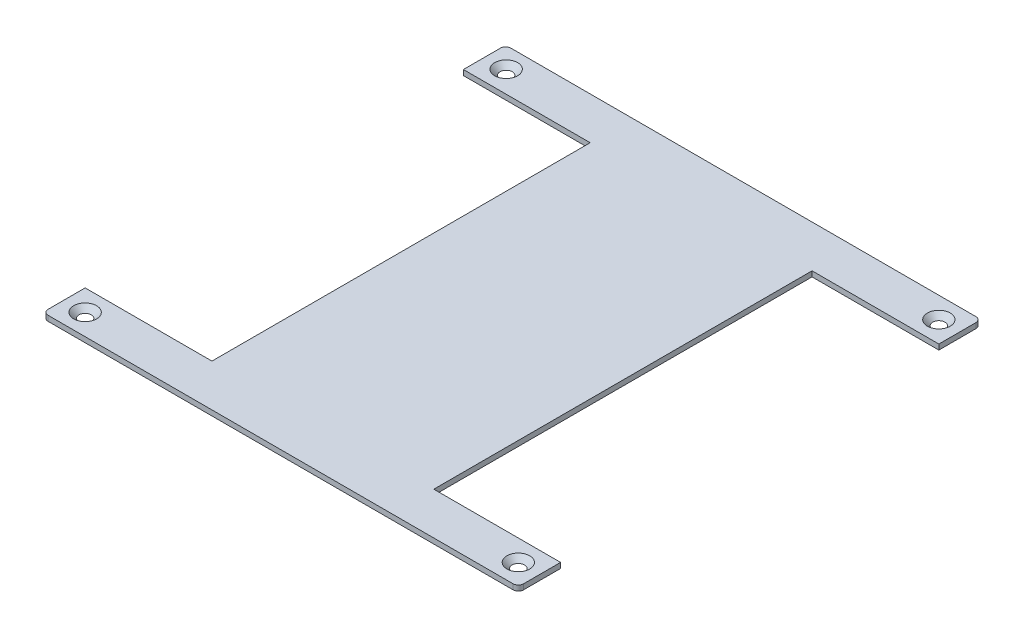
ISO-10303-21;
HEADER;
FILE_DESCRIPTION(('STEP AP214'),'2;1');
FILE_NAME('part.step','',(''),(''),'','','');
FILE_SCHEMA(('AUTOMOTIVE_DESIGN { 1 0 10303 214 1 1 1 1 }'));
ENDSEC;
DATA;
#1=APPLICATION_CONTEXT('core data for automotive mechanical design processes');
#2=APPLICATION_PROTOCOL_DEFINITION('international standard','automotive_design',2000,#1);
#3=PRODUCT_CONTEXT('',#1,'mechanical');
#4=PRODUCT('Part','Part','',(#3));
#5=PRODUCT_RELATED_PRODUCT_CATEGORY('part','',(#4));
#6=PRODUCT_DEFINITION_FORMATION('','',#4);
#7=PRODUCT_DEFINITION_CONTEXT('part definition',#1,'design');
#8=PRODUCT_DEFINITION('design','',#6,#7);
#9=PRODUCT_DEFINITION_SHAPE('','',#8);
#10=(LENGTH_UNIT() NAMED_UNIT(*) SI_UNIT(.MILLI.,.METRE.));
#11=(NAMED_UNIT(*) PLANE_ANGLE_UNIT() SI_UNIT($,.RADIAN.));
#12=(NAMED_UNIT(*) SI_UNIT($,.STERADIAN.) SOLID_ANGLE_UNIT());
#13=UNCERTAINTY_MEASURE_WITH_UNIT(LENGTH_MEASURE(1.E-05),#10,'distance_accuracy_value','');
#14=(GEOMETRIC_REPRESENTATION_CONTEXT(3) GLOBAL_UNCERTAINTY_ASSIGNED_CONTEXT((#13)) GLOBAL_UNIT_ASSIGNED_CONTEXT((#10,
#11,#12)) REPRESENTATION_CONTEXT('',''));
#15=CARTESIAN_POINT('',(0.,0.,0.));
#16=DIRECTION('',(0.,0.,1.));
#17=DIRECTION('',(1.,0.,0.));
#18=AXIS2_PLACEMENT_3D('',#15,#16,#17);
#19=CARTESIAN_POINT('',(-70.2264196721312,1.27,-30.9546885245902));
#20=DIRECTION('',(1.,0.,0.));
#21=DIRECTION('',(0.,0.,-1.));
#22=AXIS2_PLACEMENT_3D('',#19,#20,#21);
#23=PLANE('',#22);
#24=DIRECTION('',(0.,0.,1.));
#25=VECTOR('',#24,1.);
#26=CARTESIAN_POINT('',(-70.2264196721312,1.27,-30.9546885245902));
#27=LINE('',#26,#25);
#28=CARTESIAN_POINT('',(-70.2264196721312,1.27,70.1373114754098));
#29=VERTEX_POINT('',#28);
#30=CARTESIAN_POINT('',(-70.2264196721312,1.27,79.0273114754098));
#31=VERTEX_POINT('',#30);
#32=EDGE_CURVE('E199',#29,#31,#27,.T.);
#33=ORIENTED_EDGE('',*,*,#32,.F.);
#34=DIRECTION('',(0.,1.,0.));
#35=VECTOR('',#34,1.);
#36=CARTESIAN_POINT('',(-70.2264196721312,-3.81,70.1373114754098));
#37=LINE('',#36,#35);
#38=CARTESIAN_POINT('',(-70.2264196721312,0.,70.1373114754098));
#39=VERTEX_POINT('',#38);
#40=EDGE_CURVE('E272',#39,#29,#37,.T.);
#41=ORIENTED_EDGE('',*,*,#40,.F.);
#42=DIRECTION('',(0.,0.,1.));
#43=VECTOR('',#42,1.);
#44=CARTESIAN_POINT('',(-70.2264196721312,0.,-30.9546885245902));
#45=LINE('',#44,#43);
#46=CARTESIAN_POINT('',(-70.2264196721312,0.,79.0273114754098));
#47=VERTEX_POINT('',#46);
#48=EDGE_CURVE('E189',#39,#47,#45,.T.);
#49=ORIENTED_EDGE('',*,*,#48,.T.);
#50=DIRECTION('',(0.,-1.,0.));
#51=VECTOR('',#50,1.);
#52=CARTESIAN_POINT('',(-70.2264196721312,1.27,79.0273114754098));
#53=LINE('',#52,#51);
#54=EDGE_CURVE('E217',#47,#31,#53,.F.);
#55=ORIENTED_EDGE('',*,*,#54,.T.);
#56=EDGE_LOOP('',(#33,#41,#49,#55));
#57=FACE_BOUND('',#56,.T.);
#58=ADVANCED_FACE('F35',(#57),#23,.F.);
#59=CARTESIAN_POINT('',(44.0735803278688,1.27,-30.9546885245902));
#60=DIRECTION('',(-1.,0.,0.));
#61=DIRECTION('',(0.,0.,1.));
#62=AXIS2_PLACEMENT_3D('',#59,#60,#61);
#63=PLANE('',#62);
#64=DIRECTION('',(0.,0.,-1.));
#65=VECTOR('',#64,1.);
#66=CARTESIAN_POINT('',(44.0735803278688,0.,-30.9546885245902));
#67=LINE('',#66,#65);
#68=CARTESIAN_POINT('',(44.0735803278688,0.,79.0273114754098));
#69=VERTEX_POINT('',#68);
#70=CARTESIAN_POINT('',(44.0735803278688,0.,70.1373114754098));
#71=VERTEX_POINT('',#70);
#72=EDGE_CURVE('E193',#69,#71,#67,.T.);
#73=ORIENTED_EDGE('',*,*,#72,.T.);
#74=DIRECTION('',(0.,1.,0.));
#75=VECTOR('',#74,1.);
#76=CARTESIAN_POINT('',(44.0735803278688,-3.81,70.1373114754098));
#77=LINE('',#76,#75);
#78=CARTESIAN_POINT('',(44.0735803278688,1.27,70.1373114754098));
#79=VERTEX_POINT('',#78);
#80=EDGE_CURVE('E254',#71,#79,#77,.T.);
#81=ORIENTED_EDGE('',*,*,#80,.T.);
#82=DIRECTION('',(0.,0.,-1.));
#83=VECTOR('',#82,1.);
#84=CARTESIAN_POINT('',(44.0735803278688,1.27,-30.9546885245902));
#85=LINE('',#84,#83);
#86=CARTESIAN_POINT('',(44.0735803278688,1.27,79.0273114754098));
#87=VERTEX_POINT('',#86);
#88=EDGE_CURVE('E172',#87,#79,#85,.T.);
#89=ORIENTED_EDGE('',*,*,#88,.F.);
#90=DIRECTION('',(0.,-1.,0.));
#91=VECTOR('',#90,1.);
#92=CARTESIAN_POINT('',(44.0735803278688,1.27,79.0273114754098));
#93=LINE('',#92,#91);
#94=EDGE_CURVE('E229',#87,#69,#93,.T.);
#95=ORIENTED_EDGE('',*,*,#94,.T.);
#96=EDGE_LOOP('',(#73,#81,#89,#95));
#97=FACE_BOUND('',#96,.T.);
#98=ADVANCED_FACE('F323',(#97),#63,.F.);
#99=CARTESIAN_POINT('',(-70.2264196721312,0.,-29.6846885245902));
#100=VERTEX_POINT('',#99);
#101=CARTESIAN_POINT('',(-70.2264196721312,0.,-20.7946885245901));
#102=VERTEX_POINT('',#101);
#103=EDGE_CURVE('E185',#100,#102,#45,.T.);
#104=ORIENTED_EDGE('',*,*,#103,.T.);
#105=DIRECTION('',(0.,1.,0.));
#106=VECTOR('',#105,1.);
#107=CARTESIAN_POINT('',(-70.2264196721312,-3.81,-20.7946885245901));
#108=LINE('',#107,#106);
#109=CARTESIAN_POINT('',(-70.2264196721312,1.27,-20.7946885245901));
#110=VERTEX_POINT('',#109);
#111=EDGE_CURVE('E58',#102,#110,#108,.T.);
#112=ORIENTED_EDGE('',*,*,#111,.T.);
#113=CARTESIAN_POINT('',(-70.2264196721312,1.27,-29.6846885245902));
#114=VERTEX_POINT('',#113);
#115=EDGE_CURVE('E178',#114,#110,#27,.T.);
#116=ORIENTED_EDGE('',*,*,#115,.F.);
#117=DIRECTION('',(0.,-1.,0.));
#118=VECTOR('',#117,1.);
#119=CARTESIAN_POINT('',(-70.2264196721312,1.27,-29.6846885245902));
#120=LINE('',#119,#118);
#121=EDGE_CURVE('E214',#114,#100,#120,.T.);
#122=ORIENTED_EDGE('',*,*,#121,.T.);
#123=EDGE_LOOP('',(#104,#112,#116,#122));
#124=FACE_BOUND('',#123,.T.);
#125=ADVANCED_FACE('F338',(#124),#23,.F.);
#126=CARTESIAN_POINT('',(-70.2264196721312,1.27,80.2973114754098));
#127=DIRECTION('',(0.,0.,-1.));
#128=DIRECTION('',(-1.,0.,0.));
#129=AXIS2_PLACEMENT_3D('',#126,#127,#128);
#130=PLANE('',#129);
#131=DIRECTION('',(1.,0.,0.));
#132=VECTOR('',#131,1.);
#133=CARTESIAN_POINT('',(-70.2264196721312,1.27,80.2973114754098));
#134=LINE('',#133,#132);
#135=CARTESIAN_POINT('',(-68.9564196721312,1.27,80.2973114754098));
#136=VERTEX_POINT('',#135);
#137=CARTESIAN_POINT('',(42.8035803278688,1.27,80.2973114754098));
#138=VERTEX_POINT('',#137);
#139=EDGE_CURVE('E173',#136,#138,#134,.T.);
#140=ORIENTED_EDGE('',*,*,#139,.F.);
#141=DIRECTION('',(0.,-1.,0.));
#142=VECTOR('',#141,1.);
#143=CARTESIAN_POINT('',(-68.9564196721312,1.27,80.2973114754098));
#144=LINE('',#143,#142);
#145=CARTESIAN_POINT('',(-68.9564196721312,0.,80.2973114754098));
#146=VERTEX_POINT('',#145);
#147=EDGE_CURVE('E201',#136,#146,#144,.T.);
#148=ORIENTED_EDGE('',*,*,#147,.T.);
#149=DIRECTION('',(1.,0.,0.));
#150=VECTOR('',#149,1.);
#151=CARTESIAN_POINT('',(-70.2264196721312,0.,80.2973114754098));
#152=LINE('',#151,#150);
#153=CARTESIAN_POINT('',(42.8035803278688,0.,80.2973114754098));
#154=VERTEX_POINT('',#153);
#155=EDGE_CURVE('E188',#146,#154,#152,.T.);
#156=ORIENTED_EDGE('',*,*,#155,.T.);
#157=DIRECTION('',(0.,-1.,0.));
#158=VECTOR('',#157,1.);
#159=CARTESIAN_POINT('',(42.8035803278688,1.27,80.2973114754098));
#160=LINE('',#159,#158);
#161=EDGE_CURVE('E184',#154,#138,#160,.F.);
#162=ORIENTED_EDGE('',*,*,#161,.T.);
#163=EDGE_LOOP('',(#140,#148,#156,#162));
#164=FACE_BOUND('',#163,.T.);
#165=ADVANCED_FACE('F315',(#164),#130,.F.);
#166=CARTESIAN_POINT('',(44.0735803278688,1.27,-20.7946885245902));
#167=VERTEX_POINT('',#166);
#168=CARTESIAN_POINT('',(44.0735803278688,1.27,-29.6846885245902));
#169=VERTEX_POINT('',#168);
#170=EDGE_CURVE('E162',#167,#169,#85,.T.);
#171=ORIENTED_EDGE('',*,*,#170,.F.);
#172=DIRECTION('',(0.,1.,0.));
#173=VECTOR('',#172,1.);
#174=CARTESIAN_POINT('',(44.0735803278688,-3.81,-20.7946885245902));
#175=LINE('',#174,#173);
#176=CARTESIAN_POINT('',(44.0735803278688,0.,-20.7946885245902));
#177=VERTEX_POINT('',#176);
#178=EDGE_CURVE('E146',#177,#167,#175,.T.);
#179=ORIENTED_EDGE('',*,*,#178,.F.);
#180=CARTESIAN_POINT('',(44.0735803278688,0.,-29.6846885245902));
#181=VERTEX_POINT('',#180);
#182=EDGE_CURVE('E192',#177,#181,#67,.T.);
#183=ORIENTED_EDGE('',*,*,#182,.T.);
#184=DIRECTION('',(0.,-1.,0.));
#185=VECTOR('',#184,1.);
#186=CARTESIAN_POINT('',(44.0735803278688,1.27,-29.6846885245902));
#187=LINE('',#186,#185);
#188=EDGE_CURVE('E170',#181,#169,#187,.F.);
#189=ORIENTED_EDGE('',*,*,#188,.T.);
#190=EDGE_LOOP('',(#171,#179,#183,#189));
#191=FACE_BOUND('',#190,.T.);
#192=ADVANCED_FACE('F168',(#191),#63,.F.);
#193=CARTESIAN_POINT('',(-70.2264196721312,1.27,-30.9546885245902));
#194=DIRECTION('',(0.,0.,1.));
#195=DIRECTION('',(1.,0.,0.));
#196=AXIS2_PLACEMENT_3D('',#193,#194,#195);
#197=PLANE('',#196);
#198=DIRECTION('',(-1.,0.,0.));
#199=VECTOR('',#198,1.);
#200=CARTESIAN_POINT('',(-70.2264196721312,1.27,-30.9546885245902));
#201=LINE('',#200,#199);
#202=CARTESIAN_POINT('',(42.8035803278688,1.27,-30.9546885245902));
#203=VERTEX_POINT('',#202);
#204=CARTESIAN_POINT('',(-68.9564196721312,1.27,-30.9546885245902));
#205=VERTEX_POINT('',#204);
#206=EDGE_CURVE('E176',#203,#205,#201,.T.);
#207=ORIENTED_EDGE('',*,*,#206,.F.);
#208=DIRECTION('',(0.,-1.,0.));
#209=VECTOR('',#208,1.);
#210=CARTESIAN_POINT('',(42.8035803278688,1.27,-30.9546885245902));
#211=LINE('',#210,#209);
#212=CARTESIAN_POINT('',(42.8035803278688,0.,-30.9546885245902));
#213=VERTEX_POINT('',#212);
#214=EDGE_CURVE('E234',#203,#213,#211,.T.);
#215=ORIENTED_EDGE('',*,*,#214,.T.);
#216=DIRECTION('',(-1.,0.,0.));
#217=VECTOR('',#216,1.);
#218=CARTESIAN_POINT('',(-70.2264196721312,0.,-30.9546885245902));
#219=LINE('',#218,#217);
#220=CARTESIAN_POINT('',(-68.9564196721312,0.,-30.9546885245902));
#221=VERTEX_POINT('',#220);
#222=EDGE_CURVE('E196',#213,#221,#219,.T.);
#223=ORIENTED_EDGE('',*,*,#222,.T.);
#224=DIRECTION('',(0.,-1.,0.));
#225=VECTOR('',#224,1.);
#226=CARTESIAN_POINT('',(-68.9564196721312,1.27,-30.9546885245902));
#227=LINE('',#226,#225);
#228=EDGE_CURVE('E232',#221,#205,#227,.F.);
#229=ORIENTED_EDGE('',*,*,#228,.T.);
#230=EDGE_LOOP('',(#207,#215,#223,#229));
#231=FACE_BOUND('',#230,.T.);
#232=ADVANCED_FACE('F384',(#231),#197,.F.);
#233=CARTESIAN_POINT('',(0.,1.27,0.));
#234=DIRECTION('',(0.,1.,0.));
#235=DIRECTION('',(0.,0.,1.));
#236=AXIS2_PLACEMENT_3D('',#233,#234,#235);
#237=PLANE('',#236);
#238=DIRECTION('',(1.,0.,0.));
#239=VECTOR('',#238,1.);
#240=CARTESIAN_POINT('',(13.5935803278689,1.27,70.1373114754098));
#241=LINE('',#240,#239);
#242=CARTESIAN_POINT('',(13.5935803278689,1.27,70.1373114754098));
#243=VERTEX_POINT('',#242);
#244=EDGE_CURVE('E156',#243,#79,#241,.T.);
#245=ORIENTED_EDGE('',*,*,#244,.F.);
#246=DIRECTION('',(0.,0.,1.));
#247=VECTOR('',#246,1.);
#248=CARTESIAN_POINT('',(13.5935803278688,1.27,-20.7946885245902));
#249=LINE('',#248,#247);
#250=CARTESIAN_POINT('',(13.5935803278688,1.27,-20.7946885245902));
#251=VERTEX_POINT('',#250);
#252=EDGE_CURVE('E165',#251,#243,#249,.T.);
#253=ORIENTED_EDGE('',*,*,#252,.F.);
#254=DIRECTION('',(-1.,0.,0.));
#255=VECTOR('',#254,1.);
#256=CARTESIAN_POINT('',(44.0735803278688,1.27,-20.7946885245902));
#257=LINE('',#256,#255);
#258=EDGE_CURVE('E149',#167,#251,#257,.T.);
#259=ORIENTED_EDGE('',*,*,#258,.F.);
#260=ORIENTED_EDGE('',*,*,#170,.T.);
#261=CARTESIAN_POINT('',(42.8035803278688,1.27,-29.6846885245902));
#262=DIRECTION('',(0.,1.,0.));
#263=DIRECTION('',(0.,0.,1.));
#264=AXIS2_PLACEMENT_3D('',#261,#262,#263);
#265=CIRCLE('',#264,1.27);
#266=EDGE_CURVE('E222',#169,#203,#265,.T.);
#267=ORIENTED_EDGE('',*,*,#266,.T.);
#268=ORIENTED_EDGE('',*,*,#206,.T.);
#269=CARTESIAN_POINT('',(-68.9564196721312,1.27,-29.6846885245902));
#270=DIRECTION('',(0.,1.,0.));
#271=DIRECTION('',(0.,0.,1.));
#272=AXIS2_PLACEMENT_3D('',#269,#270,#271);
#273=CIRCLE('',#272,1.27);
#274=EDGE_CURVE('E220',#205,#114,#273,.T.);
#275=ORIENTED_EDGE('',*,*,#274,.T.);
#276=ORIENTED_EDGE('',*,*,#115,.T.);
#277=DIRECTION('',(-1.,0.,0.));
#278=VECTOR('',#277,1.);
#279=CARTESIAN_POINT('',(-70.2264196721312,1.27,-20.7946885245901));
#280=LINE('',#279,#278);
#281=CARTESIAN_POINT('',(-39.7464196721312,1.27,-20.7946885245901));
#282=VERTEX_POINT('',#281);
#283=EDGE_CURVE('E265',#282,#110,#280,.T.);
#284=ORIENTED_EDGE('',*,*,#283,.F.);
#285=DIRECTION('',(0.,0.,-1.));
#286=VECTOR('',#285,1.);
#287=CARTESIAN_POINT('',(-39.7464196721312,1.27,-20.7946885245901));
#288=LINE('',#287,#286);
#289=CARTESIAN_POINT('',(-39.7464196721312,1.27,70.1373114754098));
#290=VERTEX_POINT('',#289);
#291=EDGE_CURVE('E262',#290,#282,#288,.T.);
#292=ORIENTED_EDGE('',*,*,#291,.F.);
#293=DIRECTION('',(1.,0.,0.));
#294=VECTOR('',#293,1.);
#295=CARTESIAN_POINT('',(-39.7464196721312,1.27,70.1373114754098));
#296=LINE('',#295,#294);
#297=EDGE_CURVE('E267',#29,#290,#296,.T.);
#298=ORIENTED_EDGE('',*,*,#297,.F.);
#299=ORIENTED_EDGE('',*,*,#32,.T.);
#300=CARTESIAN_POINT('',(-68.9564196721312,1.27,79.0273114754098));
#301=DIRECTION('',(0.,1.,0.));
#302=DIRECTION('',(0.,0.,1.));
#303=AXIS2_PLACEMENT_3D('',#300,#301,#302);
#304=CIRCLE('',#303,1.27);
#305=EDGE_CURVE('E226',#31,#136,#304,.T.);
#306=ORIENTED_EDGE('',*,*,#305,.T.);
#307=ORIENTED_EDGE('',*,*,#139,.T.);
#308=CARTESIAN_POINT('',(42.8035803278688,1.27,79.0273114754098));
#309=DIRECTION('',(0.,1.,0.));
#310=DIRECTION('',(0.,0.,1.));
#311=AXIS2_PLACEMENT_3D('',#308,#309,#310);
#312=CIRCLE('',#311,1.27);
#313=EDGE_CURVE('E224',#138,#87,#312,.T.);
#314=ORIENTED_EDGE('',*,*,#313,.T.);
#315=ORIENTED_EDGE('',*,*,#88,.T.);
#316=EDGE_LOOP('',(#245,#253,#259,#260,#267,#268,#275,#276,#284,#292,#298,#299,#306,#307,#314,#315));
#317=FACE_BOUND('',#316,.T.);
#318=CARTESIAN_POINT('',(-65.1464196721312,1.27,-26.0016885245902));
#319=DIRECTION('',(0.,1.,0.));
#320=DIRECTION('',(0.,0.,1.));
#321=AXIS2_PLACEMENT_3D('',#318,#319,#320);
#322=CIRCLE('',#321,2.75);
#323=CARTESIAN_POINT('',(-65.1464196721312,1.27,-23.2516885245902));
#324=VERTEX_POINT('',#323);
#325=EDGE_CURVE('E257',#324,#324,#322,.T.);
#326=ORIENTED_EDGE('',*,*,#325,.F.);
#327=EDGE_LOOP('',(#326));
#328=FACE_BOUND('',#327,.T.);
#329=CARTESIAN_POINT('',(38.9935803278688,1.27,-25.8746885245902));
#330=DIRECTION('',(0.,1.,0.));
#331=DIRECTION('',(0.,0.,1.));
#332=AXIS2_PLACEMENT_3D('',#329,#330,#331);
#333=CIRCLE('',#332,2.75);
#334=CARTESIAN_POINT('',(38.9935803278688,1.27,-23.1246885245902));
#335=VERTEX_POINT('',#334);
#336=EDGE_CURVE('E281',#335,#335,#333,.T.);
#337=ORIENTED_EDGE('',*,*,#336,.F.);
#338=EDGE_LOOP('',(#337));
#339=FACE_BOUND('',#338,.T.);
#340=CARTESIAN_POINT('',(38.9935803278688,1.27,75.2173114754098));
#341=DIRECTION('',(0.,1.,0.));
#342=DIRECTION('',(0.,0.,1.));
#343=AXIS2_PLACEMENT_3D('',#340,#341,#342);
#344=CIRCLE('',#343,2.75);
#345=CARTESIAN_POINT('',(38.9935803278688,1.27,77.9673114754098));
#346=VERTEX_POINT('',#345);
#347=EDGE_CURVE('E287',#346,#346,#344,.T.);
#348=ORIENTED_EDGE('',*,*,#347,.F.);
#349=EDGE_LOOP('',(#348));
#350=FACE_BOUND('',#349,.T.);
#351=CARTESIAN_POINT('',(-65.1464196721312,1.27,75.2173114754098));
#352=DIRECTION('',(0.,1.,0.));
#353=DIRECTION('',(0.,0.,1.));
#354=AXIS2_PLACEMENT_3D('',#351,#352,#353);
#355=CIRCLE('',#354,2.75);
#356=CARTESIAN_POINT('',(-65.1464196721312,1.27,77.9673114754098));
#357=VERTEX_POINT('',#356);
#358=EDGE_CURVE('E293',#357,#357,#355,.T.);
#359=ORIENTED_EDGE('',*,*,#358,.F.);
#360=EDGE_LOOP('',(#359));
#361=FACE_BOUND('',#360,.T.);
#362=ADVANCED_FACE('F160',(#317,#328,#339,#350,#361),#237,.T.);
#363=CARTESIAN_POINT('',(0.,0.,0.));
#364=DIRECTION('',(0.,1.,0.));
#365=DIRECTION('',(0.,0.,1.));
#366=AXIS2_PLACEMENT_3D('',#363,#364,#365);
#367=PLANE('',#366);
#368=CARTESIAN_POINT('',(-65.1464196721312,0.,-26.0016885245902));
#369=DIRECTION('',(0.,1.,0.));
#370=DIRECTION('',(0.,0.,1.));
#371=AXIS2_PLACEMENT_3D('',#368,#369,#370);
#372=CIRCLE('',#371,1.48);
#373=CARTESIAN_POINT('',(-65.1464196721312,0.,-24.5216885245902));
#374=VERTEX_POINT('',#373);
#375=EDGE_CURVE('E278',#374,#374,#372,.T.);
#376=ORIENTED_EDGE('',*,*,#375,.T.);
#377=EDGE_LOOP('',(#376));
#378=FACE_BOUND('',#377,.T.);
#379=CARTESIAN_POINT('',(38.9935803278688,0.,-25.8746885245902));
#380=DIRECTION('',(0.,1.,0.));
#381=DIRECTION('',(0.,0.,1.));
#382=AXIS2_PLACEMENT_3D('',#379,#380,#381);
#383=CIRCLE('',#382,1.48);
#384=CARTESIAN_POINT('',(38.9935803278688,0.,-24.3946885245902));
#385=VERTEX_POINT('',#384);
#386=EDGE_CURVE('E284',#385,#385,#383,.T.);
#387=ORIENTED_EDGE('',*,*,#386,.T.);
#388=EDGE_LOOP('',(#387));
#389=FACE_BOUND('',#388,.T.);
#390=CARTESIAN_POINT('',(38.9935803278688,0.,75.2173114754098));
#391=DIRECTION('',(0.,1.,0.));
#392=DIRECTION('',(0.,0.,1.));
#393=AXIS2_PLACEMENT_3D('',#390,#391,#392);
#394=CIRCLE('',#393,1.48);
#395=CARTESIAN_POINT('',(38.9935803278688,0.,76.6973114754098));
#396=VERTEX_POINT('',#395);
#397=EDGE_CURVE('E290',#396,#396,#394,.T.);
#398=ORIENTED_EDGE('',*,*,#397,.T.);
#399=EDGE_LOOP('',(#398));
#400=FACE_BOUND('',#399,.T.);
#401=CARTESIAN_POINT('',(-65.1464196721312,0.,75.2173114754098));
#402=DIRECTION('',(0.,1.,0.));
#403=DIRECTION('',(0.,0.,1.));
#404=AXIS2_PLACEMENT_3D('',#401,#402,#403);
#405=CIRCLE('',#404,1.48);
#406=CARTESIAN_POINT('',(-65.1464196721312,0.,76.6973114754098));
#407=VERTEX_POINT('',#406);
#408=EDGE_CURVE('E296',#407,#407,#405,.T.);
#409=ORIENTED_EDGE('',*,*,#408,.T.);
#410=EDGE_LOOP('',(#409));
#411=FACE_BOUND('',#410,.T.);
#412=DIRECTION('',(0.,0.,1.));
#413=VECTOR('',#412,1.);
#414=CARTESIAN_POINT('',(13.5935803278688,0.,0.));
#415=LINE('',#414,#413);
#416=CARTESIAN_POINT('',(13.5935803278688,0.,-20.7946885245902));
#417=VERTEX_POINT('',#416);
#418=CARTESIAN_POINT('',(13.5935803278689,0.,70.1373114754098));
#419=VERTEX_POINT('',#418);
#420=EDGE_CURVE('E43',#417,#419,#415,.T.);
#421=ORIENTED_EDGE('',*,*,#420,.T.);
#422=DIRECTION('',(1.,0.,0.));
#423=VECTOR('',#422,1.);
#424=CARTESIAN_POINT('',(0.,0.,70.1373114754098));
#425=LINE('',#424,#423);
#426=EDGE_CURVE('E11',#419,#71,#425,.T.);
#427=ORIENTED_EDGE('',*,*,#426,.T.);
#428=ORIENTED_EDGE('',*,*,#72,.F.);
#429=CARTESIAN_POINT('',(42.8035803278688,0.,79.0273114754098));
#430=DIRECTION('',(0.,1.,0.));
#431=DIRECTION('',(0.,0.,1.));
#432=AXIS2_PLACEMENT_3D('',#429,#430,#431);
#433=CIRCLE('',#432,1.27);
#434=EDGE_CURVE('E209',#69,#154,#433,.F.);
#435=ORIENTED_EDGE('',*,*,#434,.T.);
#436=ORIENTED_EDGE('',*,*,#155,.F.);
#437=CARTESIAN_POINT('',(-68.9564196721312,0.,79.0273114754098));
#438=DIRECTION('',(0.,1.,0.));
#439=DIRECTION('',(0.,0.,1.));
#440=AXIS2_PLACEMENT_3D('',#437,#438,#439);
#441=CIRCLE('',#440,1.27);
#442=EDGE_CURVE('E211',#146,#47,#441,.F.);
#443=ORIENTED_EDGE('',*,*,#442,.T.);
#444=ORIENTED_EDGE('',*,*,#48,.F.);
#445=DIRECTION('',(1.,0.,0.));
#446=VECTOR('',#445,1.);
#447=CARTESIAN_POINT('',(0.,0.,70.1373114754098));
#448=LINE('',#447,#446);
#449=CARTESIAN_POINT('',(-39.7464196721312,0.,70.1373114754098));
#450=VERTEX_POINT('',#449);
#451=EDGE_CURVE('E242',#39,#450,#448,.T.);
#452=ORIENTED_EDGE('',*,*,#451,.T.);
#453=DIRECTION('',(0.,0.,-1.));
#454=VECTOR('',#453,1.);
#455=CARTESIAN_POINT('',(-39.7464196721312,0.,0.));
#456=LINE('',#455,#454);
#457=CARTESIAN_POINT('',(-39.7464196721312,0.,-20.7946885245901));
#458=VERTEX_POINT('',#457);
#459=EDGE_CURVE('E239',#450,#458,#456,.T.);
#460=ORIENTED_EDGE('',*,*,#459,.T.);
#461=DIRECTION('',(-1.,0.,0.));
#462=VECTOR('',#461,1.);
#463=CARTESIAN_POINT('',(0.,0.,-20.7946885245901));
#464=LINE('',#463,#462);
#465=EDGE_CURVE('E237',#458,#102,#464,.T.);
#466=ORIENTED_EDGE('',*,*,#465,.T.);
#467=ORIENTED_EDGE('',*,*,#103,.F.);
#468=CARTESIAN_POINT('',(-68.9564196721312,0.,-29.6846885245902));
#469=DIRECTION('',(0.,1.,0.));
#470=DIRECTION('',(0.,0.,1.));
#471=AXIS2_PLACEMENT_3D('',#468,#469,#470);
#472=CIRCLE('',#471,1.27);
#473=EDGE_CURVE('E204',#100,#221,#472,.F.);
#474=ORIENTED_EDGE('',*,*,#473,.T.);
#475=ORIENTED_EDGE('',*,*,#222,.F.);
#476=CARTESIAN_POINT('',(42.8035803278688,0.,-29.6846885245902));
#477=DIRECTION('',(0.,1.,0.));
#478=DIRECTION('',(0.,0.,1.));
#479=AXIS2_PLACEMENT_3D('',#476,#477,#478);
#480=CIRCLE('',#479,1.27);
#481=EDGE_CURVE('E206',#213,#181,#480,.F.);
#482=ORIENTED_EDGE('',*,*,#481,.T.);
#483=ORIENTED_EDGE('',*,*,#182,.F.);
#484=DIRECTION('',(-1.,0.,0.));
#485=VECTOR('',#484,1.);
#486=CARTESIAN_POINT('',(0.,0.,-20.7946885245902));
#487=LINE('',#486,#485);
#488=EDGE_CURVE('E152',#177,#417,#487,.T.);
#489=ORIENTED_EDGE('',*,*,#488,.T.);
#490=EDGE_LOOP('',(#421,#427,#428,#435,#436,#443,#444,#452,#460,#466,#467,#474,#475,#482,#483,#489));
#491=FACE_BOUND('',#490,.T.);
#492=ADVANCED_FACE('F247',(#378,#389,#400,#411,#491),#367,.F.);
#493=CARTESIAN_POINT('',(-65.1464196721312,1.27,75.2173114754098));
#494=DIRECTION('',(0.,1.,0.));
#495=DIRECTION('',(0.,0.,1.));
#496=AXIS2_PLACEMENT_3D('',#493,#494,#495);
#497=CONICAL_SURFACE('',#496,2.75,0.785398163397448);
#498=ORIENTED_EDGE('',*,*,#408,.F.);
#499=EDGE_LOOP('',(#498));
#500=FACE_BOUND('',#499,.T.);
#501=ORIENTED_EDGE('',*,*,#358,.T.);
#502=EDGE_LOOP('',(#501));
#503=FACE_BOUND('',#502,.T.);
#504=ADVANCED_FACE('F377',(#500,#503),#497,.F.);
#505=CARTESIAN_POINT('',(38.9935803278688,1.27,75.2173114754098));
#506=DIRECTION('',(0.,1.,0.));
#507=DIRECTION('',(0.,0.,1.));
#508=AXIS2_PLACEMENT_3D('',#505,#506,#507);
#509=CONICAL_SURFACE('',#508,2.75,0.78539816339745);
#510=ORIENTED_EDGE('',*,*,#397,.F.);
#511=EDGE_LOOP('',(#510));
#512=FACE_BOUND('',#511,.T.);
#513=ORIENTED_EDGE('',*,*,#347,.T.);
#514=EDGE_LOOP('',(#513));
#515=FACE_BOUND('',#514,.T.);
#516=ADVANCED_FACE('F373',(#512,#515),#509,.F.);
#517=CARTESIAN_POINT('',(38.9935803278688,1.27,-25.8746885245902));
#518=DIRECTION('',(0.,1.,0.));
#519=DIRECTION('',(0.,0.,1.));
#520=AXIS2_PLACEMENT_3D('',#517,#518,#519);
#521=CONICAL_SURFACE('',#520,2.75,0.78539816339745);
#522=ORIENTED_EDGE('',*,*,#386,.F.);
#523=EDGE_LOOP('',(#522));
#524=FACE_BOUND('',#523,.T.);
#525=ORIENTED_EDGE('',*,*,#336,.T.);
#526=EDGE_LOOP('',(#525));
#527=FACE_BOUND('',#526,.T.);
#528=ADVANCED_FACE('F369',(#524,#527),#521,.F.);
#529=CARTESIAN_POINT('',(-65.1464196721312,1.27,-26.0016885245902));
#530=DIRECTION('',(0.,1.,0.));
#531=DIRECTION('',(0.,0.,1.));
#532=AXIS2_PLACEMENT_3D('',#529,#530,#531);
#533=CONICAL_SURFACE('',#532,2.75,0.785398163397448);
#534=ORIENTED_EDGE('',*,*,#375,.F.);
#535=EDGE_LOOP('',(#534));
#536=FACE_BOUND('',#535,.T.);
#537=ORIENTED_EDGE('',*,*,#325,.T.);
#538=EDGE_LOOP('',(#537));
#539=FACE_BOUND('',#538,.T.);
#540=ADVANCED_FACE('F366',(#536,#539),#533,.F.);
#541=CARTESIAN_POINT('',(-68.9564196721312,1.27,79.0273114754098));
#542=DIRECTION('',(0.,-1.,0.));
#543=DIRECTION('',(0.,0.,-1.));
#544=AXIS2_PLACEMENT_3D('',#541,#542,#543);
#545=CYLINDRICAL_SURFACE('',#544,1.27);
#546=ORIENTED_EDGE('',*,*,#305,.F.);
#547=ORIENTED_EDGE('',*,*,#54,.F.);
#548=ORIENTED_EDGE('',*,*,#442,.F.);
#549=ORIENTED_EDGE('',*,*,#147,.F.);
#550=EDGE_LOOP('',(#546,#547,#548,#549));
#551=FACE_BOUND('',#550,.T.);
#552=ADVANCED_FACE('F312',(#551),#545,.T.);
#553=CARTESIAN_POINT('',(42.8035803278688,1.27,79.0273114754098));
#554=DIRECTION('',(0.,-1.,0.));
#555=DIRECTION('',(0.,0.,-1.));
#556=AXIS2_PLACEMENT_3D('',#553,#554,#555);
#557=CYLINDRICAL_SURFACE('',#556,1.27);
#558=ORIENTED_EDGE('',*,*,#313,.F.);
#559=ORIENTED_EDGE('',*,*,#161,.F.);
#560=ORIENTED_EDGE('',*,*,#434,.F.);
#561=ORIENTED_EDGE('',*,*,#94,.F.);
#562=EDGE_LOOP('',(#558,#559,#560,#561));
#563=FACE_BOUND('',#562,.T.);
#564=ADVANCED_FACE('F320',(#563),#557,.T.);
#565=CARTESIAN_POINT('',(42.8035803278688,1.27,-29.6846885245902));
#566=DIRECTION('',(0.,-1.,0.));
#567=DIRECTION('',(0.,0.,-1.));
#568=AXIS2_PLACEMENT_3D('',#565,#566,#567);
#569=CYLINDRICAL_SURFACE('',#568,1.27);
#570=ORIENTED_EDGE('',*,*,#266,.F.);
#571=ORIENTED_EDGE('',*,*,#188,.F.);
#572=ORIENTED_EDGE('',*,*,#481,.F.);
#573=ORIENTED_EDGE('',*,*,#214,.F.);
#574=EDGE_LOOP('',(#570,#571,#572,#573));
#575=FACE_BOUND('',#574,.T.);
#576=ADVANCED_FACE('F435',(#575),#569,.T.);
#577=CARTESIAN_POINT('',(-68.9564196721312,1.27,-29.6846885245902));
#578=DIRECTION('',(0.,-1.,0.));
#579=DIRECTION('',(0.,0.,-1.));
#580=AXIS2_PLACEMENT_3D('',#577,#578,#579);
#581=CYLINDRICAL_SURFACE('',#580,1.27);
#582=ORIENTED_EDGE('',*,*,#274,.F.);
#583=ORIENTED_EDGE('',*,*,#228,.F.);
#584=ORIENTED_EDGE('',*,*,#473,.F.);
#585=ORIENTED_EDGE('',*,*,#121,.F.);
#586=EDGE_LOOP('',(#582,#583,#584,#585));
#587=FACE_BOUND('',#586,.T.);
#588=ADVANCED_FACE('F37',(#587),#581,.T.);
#589=CARTESIAN_POINT('',(-39.7464196721312,-3.81,-20.7946885245901));
#590=DIRECTION('',(1.,0.,0.));
#591=DIRECTION('',(0.,0.,-1.));
#592=AXIS2_PLACEMENT_3D('',#589,#590,#591);
#593=PLANE('',#592);
#594=DIRECTION('',(0.,1.,0.));
#595=VECTOR('',#594,1.);
#596=CARTESIAN_POINT('',(-39.7464196721312,-3.81,70.1373114754098));
#597=LINE('',#596,#595);
#598=EDGE_CURVE('E166',#450,#290,#597,.T.);
#599=ORIENTED_EDGE('',*,*,#598,.T.);
#600=ORIENTED_EDGE('',*,*,#291,.T.);
#601=DIRECTION('',(0.,1.,0.));
#602=VECTOR('',#601,1.);
#603=CARTESIAN_POINT('',(-39.7464196721312,-3.81,-20.7946885245901));
#604=LINE('',#603,#602);
#605=EDGE_CURVE('E270',#458,#282,#604,.T.);
#606=ORIENTED_EDGE('',*,*,#605,.F.);
#607=ORIENTED_EDGE('',*,*,#459,.F.);
#608=EDGE_LOOP('',(#599,#600,#606,#607));
#609=FACE_BOUND('',#608,.T.);
#610=ADVANCED_FACE('F355',(#609),#593,.F.);
#611=CARTESIAN_POINT('',(-39.7464196721312,-3.81,70.1373114754098));
#612=DIRECTION('',(0.,0.,1.));
#613=DIRECTION('',(1.,0.,0.));
#614=AXIS2_PLACEMENT_3D('',#611,#612,#613);
#615=PLANE('',#614);
#616=ORIENTED_EDGE('',*,*,#40,.T.);
#617=ORIENTED_EDGE('',*,*,#297,.T.);
#618=ORIENTED_EDGE('',*,*,#598,.F.);
#619=ORIENTED_EDGE('',*,*,#451,.F.);
#620=EDGE_LOOP('',(#616,#617,#618,#619));
#621=FACE_BOUND('',#620,.T.);
#622=ADVANCED_FACE('F334',(#621),#615,.F.);
#623=CARTESIAN_POINT('',(-70.2264196721312,-3.81,-20.7946885245901));
#624=DIRECTION('',(0.,0.,-1.));
#625=DIRECTION('',(-1.,0.,0.));
#626=AXIS2_PLACEMENT_3D('',#623,#624,#625);
#627=PLANE('',#626);
#628=ORIENTED_EDGE('',*,*,#605,.T.);
#629=ORIENTED_EDGE('',*,*,#283,.T.);
#630=ORIENTED_EDGE('',*,*,#111,.F.);
#631=ORIENTED_EDGE('',*,*,#465,.F.);
#632=EDGE_LOOP('',(#628,#629,#630,#631));
#633=FACE_BOUND('',#632,.T.);
#634=ADVANCED_FACE('F327',(#633),#627,.F.);
#635=CARTESIAN_POINT('',(13.5935803278689,-3.81,70.1373114754098));
#636=DIRECTION('',(0.,0.,1.));
#637=DIRECTION('',(1.,0.,0.));
#638=AXIS2_PLACEMENT_3D('',#635,#636,#637);
#639=PLANE('',#638);
#640=DIRECTION('',(0.,1.,0.));
#641=VECTOR('',#640,1.);
#642=CARTESIAN_POINT('',(13.5935803278689,-3.81,70.1373114754098));
#643=LINE('',#642,#641);
#644=EDGE_CURVE('E252',#419,#243,#643,.T.);
#645=ORIENTED_EDGE('',*,*,#644,.T.);
#646=ORIENTED_EDGE('',*,*,#244,.T.);
#647=ORIENTED_EDGE('',*,*,#80,.F.);
#648=ORIENTED_EDGE('',*,*,#426,.F.);
#649=EDGE_LOOP('',(#645,#646,#647,#648));
#650=FACE_BOUND('',#649,.T.);
#651=ADVANCED_FACE('F325',(#650),#639,.F.);
#652=CARTESIAN_POINT('',(13.5935803278688,-3.81,-20.7946885245902));
#653=DIRECTION('',(-1.,0.,0.));
#654=DIRECTION('',(0.,0.,1.));
#655=AXIS2_PLACEMENT_3D('',#652,#653,#654);
#656=PLANE('',#655);
#657=DIRECTION('',(0.,1.,0.));
#658=VECTOR('',#657,1.);
#659=CARTESIAN_POINT('',(13.5935803278688,-3.81,-20.7946885245902));
#660=LINE('',#659,#658);
#661=EDGE_CURVE('E50',#417,#251,#660,.T.);
#662=ORIENTED_EDGE('',*,*,#661,.T.);
#663=ORIENTED_EDGE('',*,*,#252,.T.);
#664=ORIENTED_EDGE('',*,*,#644,.F.);
#665=ORIENTED_EDGE('',*,*,#420,.F.);
#666=EDGE_LOOP('',(#662,#663,#664,#665));
#667=FACE_BOUND('',#666,.T.);
#668=ADVANCED_FACE('F251',(#667),#656,.F.);
#669=CARTESIAN_POINT('',(44.0735803278688,-3.81,-20.7946885245902));
#670=DIRECTION('',(0.,0.,-1.));
#671=DIRECTION('',(-1.,0.,0.));
#672=AXIS2_PLACEMENT_3D('',#669,#670,#671);
#673=PLANE('',#672);
#674=ORIENTED_EDGE('',*,*,#178,.T.);
#675=ORIENTED_EDGE('',*,*,#258,.T.);
#676=ORIENTED_EDGE('',*,*,#661,.F.);
#677=ORIENTED_EDGE('',*,*,#488,.F.);
#678=EDGE_LOOP('',(#674,#675,#676,#677));
#679=FACE_BOUND('',#678,.T.);
#680=ADVANCED_FACE('F148',(#679),#673,.F.);
#681=CLOSED_SHELL('',(#58,#98,#125,#165,#192,#232,#362,#492,#504,#516,#528,#540,#552,#564,#576,
#588,#610,#622,#634,#651,#668,#680));
#682=MANIFOLD_SOLID_BREP('B2',#681);
#683=ADVANCED_BREP_SHAPE_REPRESENTATION('',(#18,#682),#14);
#684=SHAPE_DEFINITION_REPRESENTATION(#9,#683);
ENDSEC;
END-ISO-10303-21;
